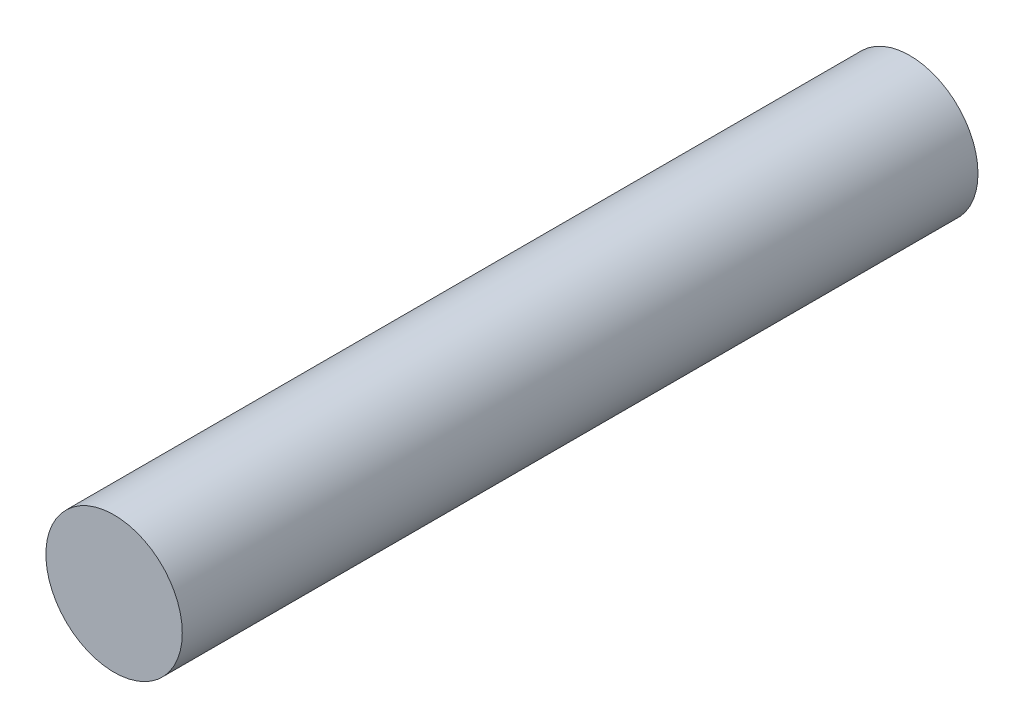
ISO-10303-21;
HEADER;
FILE_DESCRIPTION(('STEP AP214'),'2;1');
FILE_NAME('part.step','',(''),(''),'','','');
FILE_SCHEMA(('AUTOMOTIVE_DESIGN { 1 0 10303 214 1 1 1 1 }'));
ENDSEC;
DATA;
#1=APPLICATION_CONTEXT('core data for automotive mechanical design processes');
#2=APPLICATION_PROTOCOL_DEFINITION('international standard','automotive_design',2000,#1);
#3=PRODUCT_CONTEXT('',#1,'mechanical');
#4=PRODUCT('Part','Part','',(#3));
#5=PRODUCT_RELATED_PRODUCT_CATEGORY('part','',(#4));
#6=PRODUCT_DEFINITION_FORMATION('','',#4);
#7=PRODUCT_DEFINITION_CONTEXT('part definition',#1,'design');
#8=PRODUCT_DEFINITION('design','',#6,#7);
#9=PRODUCT_DEFINITION_SHAPE('','',#8);
#10=(LENGTH_UNIT() NAMED_UNIT(*) SI_UNIT(.MILLI.,.METRE.));
#11=(NAMED_UNIT(*) PLANE_ANGLE_UNIT() SI_UNIT($,.RADIAN.));
#12=(NAMED_UNIT(*) SI_UNIT($,.STERADIAN.) SOLID_ANGLE_UNIT());
#13=UNCERTAINTY_MEASURE_WITH_UNIT(LENGTH_MEASURE(1.E-05),#10,'distance_accuracy_value','');
#14=(GEOMETRIC_REPRESENTATION_CONTEXT(3) GLOBAL_UNCERTAINTY_ASSIGNED_CONTEXT((#13)) GLOBAL_UNIT_ASSIGNED_CONTEXT((#10,
#11,#12)) REPRESENTATION_CONTEXT('',''));
#15=CARTESIAN_POINT('',(0.,0.,0.));
#16=DIRECTION('',(0.,0.,1.));
#17=DIRECTION('',(1.,0.,0.));
#18=AXIS2_PLACEMENT_3D('',#15,#16,#17);
#19=CARTESIAN_POINT('',(0.,0.,350.));
#20=DIRECTION('',(0.,0.,-1.));
#21=DIRECTION('',(-1.,0.,0.));
#22=AXIS2_PLACEMENT_3D('',#19,#20,#21);
#23=CYLINDRICAL_SURFACE('',#22,30.);
#24=CARTESIAN_POINT('',(0.,0.,350.));
#25=DIRECTION('',(0.,0.,1.));
#26=DIRECTION('',(1.,0.,0.));
#27=AXIS2_PLACEMENT_3D('',#24,#25,#26);
#28=CIRCLE('',#27,30.);
#29=CARTESIAN_POINT('',(30.,0.,350.));
#30=VERTEX_POINT('',#29);
#31=EDGE_CURVE('E10',#30,#30,#28,.T.);
#32=ORIENTED_EDGE('',*,*,#31,.F.);
#33=EDGE_LOOP('',(#32));
#34=FACE_BOUND('',#33,.T.);
#35=CARTESIAN_POINT('',(0.,0.,0.));
#36=DIRECTION('',(0.,0.,1.));
#37=DIRECTION('',(1.,0.,0.));
#38=AXIS2_PLACEMENT_3D('',#35,#36,#37);
#39=CIRCLE('',#38,30.);
#40=CARTESIAN_POINT('',(30.,0.,0.));
#41=VERTEX_POINT('',#40);
#42=EDGE_CURVE('E38',#41,#41,#39,.T.);
#43=ORIENTED_EDGE('',*,*,#42,.T.);
#44=EDGE_LOOP('',(#43));
#45=FACE_BOUND('',#44,.T.);
#46=ADVANCED_FACE('F35',(#34,#45),#23,.T.);
#47=CARTESIAN_POINT('',(0.,0.,350.));
#48=DIRECTION('',(0.,0.,1.));
#49=DIRECTION('',(1.,0.,0.));
#50=AXIS2_PLACEMENT_3D('',#47,#48,#49);
#51=PLANE('',#50);
#52=ORIENTED_EDGE('',*,*,#31,.T.);
#53=EDGE_LOOP('',(#52));
#54=FACE_BOUND('',#53,.T.);
#55=ADVANCED_FACE('F50',(#54),#51,.T.);
#56=CARTESIAN_POINT('',(0.,0.,0.));
#57=DIRECTION('',(0.,0.,1.));
#58=DIRECTION('',(1.,0.,0.));
#59=AXIS2_PLACEMENT_3D('',#56,#57,#58);
#60=PLANE('',#59);
#61=ORIENTED_EDGE('',*,*,#42,.F.);
#62=EDGE_LOOP('',(#61));
#63=FACE_BOUND('',#62,.T.);
#64=ADVANCED_FACE('F48',(#63),#60,.F.);
#65=CLOSED_SHELL('',(#46,#55,#64));
#66=MANIFOLD_SOLID_BREP('B2',#65);
#67=ADVANCED_BREP_SHAPE_REPRESENTATION('',(#18,#66),#14);
#68=SHAPE_DEFINITION_REPRESENTATION(#9,#67);
ENDSEC;
END-ISO-10303-21;
